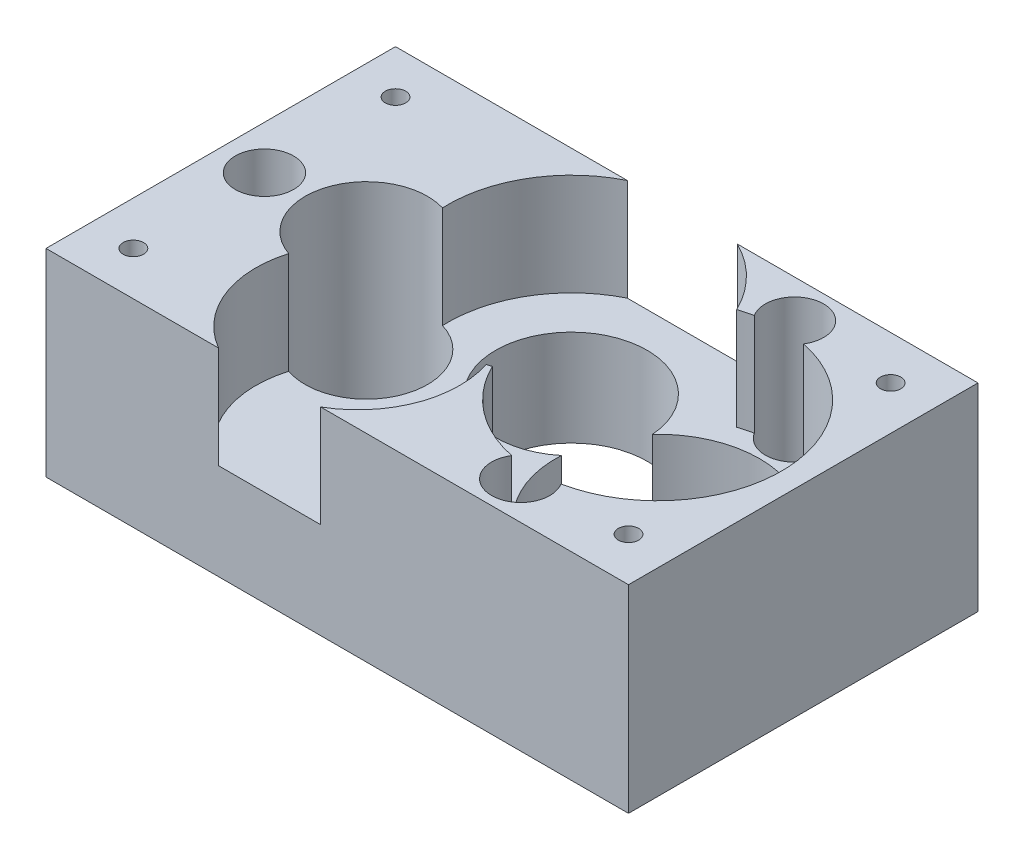
ISO-10303-21;
HEADER;
FILE_DESCRIPTION(('STEP AP214'),'2;1');
FILE_NAME('part.step','',(''),(''),'','','');
FILE_SCHEMA(('AUTOMOTIVE_DESIGN { 1 0 10303 214 1 1 1 1 }'));
ENDSEC;
DATA;
#1=APPLICATION_CONTEXT('core data for automotive mechanical design processes');
#2=APPLICATION_PROTOCOL_DEFINITION('international standard','automotive_design',2000,#1);
#3=PRODUCT_CONTEXT('',#1,'mechanical');
#4=PRODUCT('Part','Part','',(#3));
#5=PRODUCT_RELATED_PRODUCT_CATEGORY('part','',(#4));
#6=PRODUCT_DEFINITION_FORMATION('','',#4);
#7=PRODUCT_DEFINITION_CONTEXT('part definition',#1,'design');
#8=PRODUCT_DEFINITION('design','',#6,#7);
#9=PRODUCT_DEFINITION_SHAPE('','',#8);
#10=(LENGTH_UNIT() NAMED_UNIT(*) SI_UNIT(.MILLI.,.METRE.));
#11=(NAMED_UNIT(*) PLANE_ANGLE_UNIT() SI_UNIT($,.RADIAN.));
#12=(NAMED_UNIT(*) SI_UNIT($,.STERADIAN.) SOLID_ANGLE_UNIT());
#13=UNCERTAINTY_MEASURE_WITH_UNIT(LENGTH_MEASURE(1.E-05),#10,'distance_accuracy_value','');
#14=(GEOMETRIC_REPRESENTATION_CONTEXT(3) GLOBAL_UNCERTAINTY_ASSIGNED_CONTEXT((#13)) GLOBAL_UNIT_ASSIGNED_CONTEXT((#10,
#11,#12)) REPRESENTATION_CONTEXT('',''));
#15=CARTESIAN_POINT('',(0.,0.,0.));
#16=DIRECTION('',(0.,0.,1.));
#17=DIRECTION('',(1.,0.,0.));
#18=AXIS2_PLACEMENT_3D('',#15,#16,#17);
#19=CARTESIAN_POINT('',(15.,6.8,1.3));
#20=DIRECTION('',(0.,-1.,0.));
#21=DIRECTION('',(0.,0.,-1.));
#22=AXIS2_PLACEMENT_3D('',#19,#20,#21);
#23=CYLINDRICAL_SURFACE('',#22,0.75);
#24=CARTESIAN_POINT('',(15.,0.,1.3));
#25=DIRECTION('',(0.,1.,0.));
#26=DIRECTION('',(0.,0.,1.));
#27=AXIS2_PLACEMENT_3D('',#24,#25,#26);
#28=CIRCLE('',#27,0.75);
#29=CARTESIAN_POINT('',(15.,0.,2.05));
#30=VERTEX_POINT('',#29);
#31=EDGE_CURVE('E410',#30,#30,#28,.F.);
#32=ORIENTED_EDGE('',*,*,#31,.T.);
#33=EDGE_LOOP('',(#32));
#34=FACE_BOUND('',#33,.T.);
#35=CARTESIAN_POINT('',(15.,1.,1.3));
#36=DIRECTION('',(0.,1.,0.));
#37=DIRECTION('',(0.,0.,1.));
#38=AXIS2_PLACEMENT_3D('',#35,#36,#37);
#39=CIRCLE('',#38,0.75);
#40=CARTESIAN_POINT('',(15.,1.,2.05));
#41=VERTEX_POINT('',#40);
#42=EDGE_CURVE('E107',#41,#41,#39,.T.);
#43=ORIENTED_EDGE('',*,*,#42,.T.);
#44=EDGE_LOOP('',(#43));
#45=FACE_BOUND('',#44,.T.);
#46=ADVANCED_FACE('F103',(#34,#45),#23,.F.);
#47=CARTESIAN_POINT('',(15.,6.8,10.7));
#48=DIRECTION('',(0.,-1.,0.));
#49=DIRECTION('',(0.,0.,-1.));
#50=AXIS2_PLACEMENT_3D('',#47,#48,#49);
#51=CYLINDRICAL_SURFACE('',#50,0.750000000000002);
#52=CARTESIAN_POINT('',(15.,0.,10.7));
#53=DIRECTION('',(0.,1.,0.));
#54=DIRECTION('',(0.,0.,1.));
#55=AXIS2_PLACEMENT_3D('',#52,#53,#54);
#56=CIRCLE('',#55,0.750000000000002);
#57=CARTESIAN_POINT('',(15.,0.,11.45));
#58=VERTEX_POINT('',#57);
#59=EDGE_CURVE('E412',#58,#58,#56,.F.);
#60=ORIENTED_EDGE('',*,*,#59,.T.);
#61=EDGE_LOOP('',(#60));
#62=FACE_BOUND('',#61,.T.);
#63=CARTESIAN_POINT('',(15.,1.,10.7));
#64=DIRECTION('',(0.,1.,0.));
#65=DIRECTION('',(0.,0.,1.));
#66=AXIS2_PLACEMENT_3D('',#63,#64,#65);
#67=CIRCLE('',#66,0.750000000000002);
#68=CARTESIAN_POINT('',(15.,1.,11.45));
#69=VERTEX_POINT('',#68);
#70=EDGE_CURVE('E391',#69,#69,#67,.T.);
#71=ORIENTED_EDGE('',*,*,#70,.T.);
#72=EDGE_LOOP('',(#71));
#73=FACE_BOUND('',#72,.T.);
#74=ADVANCED_FACE('F497',(#62,#73),#51,.F.);
#75=CARTESIAN_POINT('',(1.49999999999999,6.8,6.));
#76=DIRECTION('',(0.,-1.,0.));
#77=DIRECTION('',(0.,0.,-1.));
#78=AXIS2_PLACEMENT_3D('',#75,#76,#77);
#79=CYLINDRICAL_SURFACE('',#78,0.75);
#80=CARTESIAN_POINT('',(1.49999999999999,0.,6.));
#81=DIRECTION('',(0.,1.,0.));
#82=DIRECTION('',(0.,0.,1.));
#83=AXIS2_PLACEMENT_3D('',#80,#81,#82);
#84=CIRCLE('',#83,0.75);
#85=CARTESIAN_POINT('',(1.49999999999999,0.,6.75));
#86=VERTEX_POINT('',#85);
#87=EDGE_CURVE('E264',#86,#86,#84,.F.);
#88=ORIENTED_EDGE('',*,*,#87,.T.);
#89=EDGE_LOOP('',(#88));
#90=FACE_BOUND('',#89,.T.);
#91=CARTESIAN_POINT('',(1.49999999999999,1.,6.));
#92=DIRECTION('',(0.,1.,0.));
#93=DIRECTION('',(0.,0.,1.));
#94=AXIS2_PLACEMENT_3D('',#91,#92,#93);
#95=CIRCLE('',#94,0.75);
#96=CARTESIAN_POINT('',(1.49999999999999,1.,6.75));
#97=VERTEX_POINT('',#96);
#98=EDGE_CURVE('E389',#97,#97,#95,.T.);
#99=ORIENTED_EDGE('',*,*,#98,.T.);
#100=EDGE_LOOP('',(#99));
#101=FACE_BOUND('',#100,.T.);
#102=ADVANCED_FACE('F503',(#90,#101),#79,.F.);
#103=CARTESIAN_POINT('',(15.,6.8,6.));
#104=DIRECTION('',(0.,-1.,0.));
#105=DIRECTION('',(0.,0.,-1.));
#106=AXIS2_PLACEMENT_3D('',#103,#104,#105);
#107=CYLINDRICAL_SURFACE('',#106,4.25);
#108=DIRECTION('',(0.,1.,0.));
#109=VECTOR('',#108,1.);
#110=CARTESIAN_POINT('',(14.1550469130083,3.9,10.1651595744681));
#111=LINE('',#110,#109);
#112=CARTESIAN_POINT('',(14.1550469130083,3.3,10.1651595744681));
#113=VERTEX_POINT('',#112);
#114=CARTESIAN_POINT('',(14.1550469130083,6.8,10.1651595744681));
#115=VERTEX_POINT('',#114);
#116=EDGE_CURVE('E120',#113,#115,#111,.T.);
#117=ORIENTED_EDGE('',*,*,#116,.F.);
#118=CARTESIAN_POINT('',(15.,3.3,6.));
#119=DIRECTION('',(0.,1.,0.));
#120=DIRECTION('',(0.,0.,1.));
#121=AXIS2_PLACEMENT_3D('',#118,#119,#120);
#122=CIRCLE('',#121,4.25);
#123=CARTESIAN_POINT('',(11.1717072162558,3.3,7.84571784461547));
#124=VERTEX_POINT('',#123);
#125=EDGE_CURVE('E283',#124,#113,#122,.T.);
#126=ORIENTED_EDGE('',*,*,#125,.F.);
#127=DIRECTION('',(0.,-1.,0.));
#128=VECTOR('',#127,1.);
#129=CARTESIAN_POINT('',(11.1717072162558,6.8,7.84571784461547));
#130=LINE('',#129,#128);
#131=CARTESIAN_POINT('',(11.1717072162558,6.8,7.84571784461547));
#132=VERTEX_POINT('',#131);
#133=EDGE_CURVE('E295',#132,#124,#130,.T.);
#134=ORIENTED_EDGE('',*,*,#133,.F.);
#135=CARTESIAN_POINT('',(15.,6.8,6.));
#136=DIRECTION('',(0.,1.,0.));
#137=DIRECTION('',(0.,0.,1.));
#138=AXIS2_PLACEMENT_3D('',#135,#136,#137);
#139=CIRCLE('',#138,4.25);
#140=EDGE_CURVE('E257',#132,#115,#139,.T.);
#141=ORIENTED_EDGE('',*,*,#140,.T.);
#142=EDGE_LOOP('',(#117,#126,#134,#141));
#143=FACE_BOUND('',#142,.T.);
#144=ADVANCED_FACE('F425',(#143),#107,.F.);
#145=DIRECTION('',(0.,1.,0.));
#146=VECTOR('',#145,1.);
#147=CARTESIAN_POINT('',(15.8449530869917,3.9,10.1651595744681));
#148=LINE('',#147,#146);
#149=CARTESIAN_POINT('',(15.8449530869917,6.8,10.1651595744681));
#150=VERTEX_POINT('',#149);
#151=CARTESIAN_POINT('',(15.8449530869917,3.3,10.1651595744681));
#152=VERTEX_POINT('',#151);
#153=EDGE_CURVE('E237',#150,#152,#148,.F.);
#154=ORIENTED_EDGE('',*,*,#153,.F.);
#155=CARTESIAN_POINT('',(15.8449530869917,6.8,1.83484042553191));
#156=VERTEX_POINT('',#155);
#157=EDGE_CURVE('E250',#150,#156,#139,.T.);
#158=ORIENTED_EDGE('',*,*,#157,.T.);
#159=DIRECTION('',(0.,1.,0.));
#160=VECTOR('',#159,1.);
#161=CARTESIAN_POINT('',(15.8449530869917,3.9,1.83484042553191));
#162=LINE('',#161,#160);
#163=CARTESIAN_POINT('',(15.8449530869917,3.3,1.83484042553191));
#164=VERTEX_POINT('',#163);
#165=EDGE_CURVE('E128',#164,#156,#162,.T.);
#166=ORIENTED_EDGE('',*,*,#165,.F.);
#167=EDGE_CURVE('E252',#152,#164,#122,.T.);
#168=ORIENTED_EDGE('',*,*,#167,.F.);
#169=EDGE_LOOP('',(#154,#158,#166,#168));
#170=FACE_BOUND('',#169,.T.);
#171=ADVANCED_FACE('F249',(#170),#107,.F.);
#172=DIRECTION('',(0.,1.,0.));
#173=VECTOR('',#172,1.);
#174=CARTESIAN_POINT('',(14.1550469130083,3.9,1.83484042553191));
#175=LINE('',#174,#173);
#176=CARTESIAN_POINT('',(14.1550469130083,6.8,1.83484042553191));
#177=VERTEX_POINT('',#176);
#178=CARTESIAN_POINT('',(14.1550469130083,3.3,1.83484042553191));
#179=VERTEX_POINT('',#178);
#180=EDGE_CURVE('E399',#177,#179,#175,.F.);
#181=ORIENTED_EDGE('',*,*,#180,.F.);
#182=CARTESIAN_POINT('',(13.6753726461814,6.8,1.96170055920618));
#183=VERTEX_POINT('',#182);
#184=EDGE_CURVE('E258',#177,#183,#139,.T.);
#185=ORIENTED_EDGE('',*,*,#184,.T.);
#186=DIRECTION('',(0.,-1.,0.));
#187=VECTOR('',#186,1.);
#188=CARTESIAN_POINT('',(13.6753726461814,6.8,1.96170055920618));
#189=LINE('',#188,#187);
#190=CARTESIAN_POINT('',(13.6753726461814,3.3,1.96170055920618));
#191=VERTEX_POINT('',#190);
#192=EDGE_CURVE('E282',#183,#191,#189,.T.);
#193=ORIENTED_EDGE('',*,*,#192,.T.);
#194=EDGE_CURVE('E287',#179,#191,#122,.T.);
#195=ORIENTED_EDGE('',*,*,#194,.F.);
#196=EDGE_LOOP('',(#181,#185,#193,#195));
#197=FACE_BOUND('',#196,.T.);
#198=ADVANCED_FACE('F455',(#197),#107,.F.);
#199=CARTESIAN_POINT('',(0.,3.3,0.));
#200=DIRECTION('',(0.,1.,0.));
#201=DIRECTION('',(0.,0.,1.));
#202=AXIS2_PLACEMENT_3D('',#199,#200,#201);
#203=PLANE('',#202);
#204=CARTESIAN_POINT('',(15.,3.3,10.7));
#205=DIRECTION('',(0.,1.,0.));
#206=DIRECTION('',(0.,0.,1.));
#207=AXIS2_PLACEMENT_3D('',#204,#205,#206);
#208=CIRCLE('',#207,1.);
#209=EDGE_CURVE('E253',#152,#113,#208,.T.);
#210=ORIENTED_EDGE('',*,*,#209,.F.);
#211=ORIENTED_EDGE('',*,*,#167,.T.);
#212=CARTESIAN_POINT('',(15.,3.3,1.3));
#213=DIRECTION('',(0.,1.,0.));
#214=DIRECTION('',(0.,0.,1.));
#215=AXIS2_PLACEMENT_3D('',#212,#213,#214);
#216=CIRCLE('',#215,1.);
#217=EDGE_CURVE('E396',#179,#164,#216,.T.);
#218=ORIENTED_EDGE('',*,*,#217,.F.);
#219=ORIENTED_EDGE('',*,*,#194,.T.);
#220=CARTESIAN_POINT('',(9.84707986243722,3.3,3.80741840382166));
#221=DIRECTION('',(0.,1.,0.));
#222=DIRECTION('',(0.,0.,1.));
#223=AXIS2_PLACEMENT_3D('',#220,#221,#222);
#224=CIRCLE('',#223,4.25);
#225=CARTESIAN_POINT('',(11.7354826526915,3.3,0.));
#226=VERTEX_POINT('',#225);
#227=EDGE_CURVE('E286',#191,#226,#224,.T.);
#228=ORIENTED_EDGE('',*,*,#227,.T.);
#229=DIRECTION('',(1.,0.,0.));
#230=VECTOR('',#229,1.);
#231=CARTESIAN_POINT('',(0.,3.3,0.));
#232=LINE('',#231,#230);
#233=CARTESIAN_POINT('',(7.95867707218294,3.3,0.));
#234=VERTEX_POINT('',#233);
#235=EDGE_CURVE('E364',#234,#226,#232,.T.);
#236=ORIENTED_EDGE('',*,*,#235,.F.);
#237=CARTESIAN_POINT('',(9.84707986243722,3.3,3.80741840382166));
#238=DIRECTION('',(0.,1.,0.));
#239=DIRECTION('',(0.,0.,1.));
#240=AXIS2_PLACEMENT_3D('',#237,#238,#239);
#241=CIRCLE('',#240,4.25);
#242=CARTESIAN_POINT('',(5.60090997093726,3.3,3.98781034521391));
#243=VERTEX_POINT('',#242);
#244=EDGE_CURVE('E297',#234,#243,#241,.T.);
#245=ORIENTED_EDGE('',*,*,#244,.T.);
#246=CARTESIAN_POINT('',(5.,3.3,6.));
#247=DIRECTION('',(0.,1.,0.));
#248=DIRECTION('',(0.,0.,1.));
#249=AXIS2_PLACEMENT_3D('',#246,#247,#248);
#250=CIRCLE('',#249,2.1);
#251=CARTESIAN_POINT('',(4.31984150225845,3.3,7.98680256139103));
#252=VERTEX_POINT('',#251);
#253=EDGE_CURVE('E355',#252,#243,#250,.T.);
#254=ORIENTED_EDGE('',*,*,#253,.F.);
#255=CARTESIAN_POINT('',(7.67873609357973,3.3,8.97058461265678));
#256=DIRECTION('',(0.,1.,0.));
#257=DIRECTION('',(0.,0.,1.));
#258=AXIS2_PLACEMENT_3D('',#255,#256,#257);
#259=CIRCLE('',#258,3.5);
#260=CARTESIAN_POINT('',(5.92584065718652,3.3,12.));
#261=VERTEX_POINT('',#260);
#262=EDGE_CURVE('E310',#252,#261,#259,.T.);
#263=ORIENTED_EDGE('',*,*,#262,.T.);
#264=DIRECTION('',(1.,0.,0.));
#265=VECTOR('',#264,1.);
#266=CARTESIAN_POINT('',(0.,3.3,12.));
#267=LINE('',#266,#265);
#268=CARTESIAN_POINT('',(9.43163152997293,3.3,12.));
#269=VERTEX_POINT('',#268);
#270=EDGE_CURVE('E361',#261,#269,#267,.T.);
#271=ORIENTED_EDGE('',*,*,#270,.T.);
#272=CARTESIAN_POINT('',(7.67873609357973,3.3,8.97058461265678));
#273=DIRECTION('',(0.,1.,0.));
#274=DIRECTION('',(0.,0.,1.));
#275=AXIS2_PLACEMENT_3D('',#272,#273,#274);
#276=CIRCLE('',#275,3.5);
#277=CARTESIAN_POINT('',(11.0094872449995,3.3,7.89536520838807));
#278=VERTEX_POINT('',#277);
#279=EDGE_CURVE('E290',#269,#278,#276,.T.);
#280=ORIENTED_EDGE('',*,*,#279,.T.);
#281=CARTESIAN_POINT('',(9.84707986243722,3.3,3.80741840382166));
#282=DIRECTION('',(0.,1.,0.));
#283=DIRECTION('',(0.,0.,1.));
#284=AXIS2_PLACEMENT_3D('',#281,#282,#283);
#285=CIRCLE('',#284,4.25);
#286=EDGE_CURVE('E261',#278,#124,#285,.T.);
#287=ORIENTED_EDGE('',*,*,#286,.T.);
#288=ORIENTED_EDGE('',*,*,#125,.T.);
#289=EDGE_LOOP('',(#210,#211,#218,#219,#228,#236,#245,#254,#263,#271,#280,#287,#288));
#290=FACE_BOUND('',#289,.T.);
#291=CARTESIAN_POINT('',(7.67873609357973,3.3,8.97058461265678));
#292=DIRECTION('',(0.,1.,0.));
#293=DIRECTION('',(0.,0.,1.));
#294=AXIS2_PLACEMENT_3D('',#291,#292,#293);
#295=CIRCLE('',#294,0.6);
#296=CARTESIAN_POINT('',(7.67873609357973,3.3,9.57058461265678));
#297=VERTEX_POINT('',#296);
#298=EDGE_CURVE('E338',#297,#297,#295,.T.);
#299=ORIENTED_EDGE('',*,*,#298,.F.);
#300=EDGE_LOOP('',(#299));
#301=FACE_BOUND('',#300,.T.);
#302=CARTESIAN_POINT('',(15.,3.3,6.));
#303=DIRECTION('',(0.,1.,0.));
#304=DIRECTION('',(0.,0.,1.));
#305=AXIS2_PLACEMENT_3D('',#302,#303,#304);
#306=CIRCLE('',#305,3.5);
#307=CARTESIAN_POINT('',(11.5051547803404,3.3,5.81011347961833));
#308=VERTEX_POINT('',#307);
#309=CARTESIAN_POINT('',(12.4398354279125,3.3,3.61346331186215));
#310=VERTEX_POINT('',#309);
#311=EDGE_CURVE('E349',#308,#310,#306,.T.);
#312=ORIENTED_EDGE('',*,*,#311,.F.);
#313=CARTESIAN_POINT('',(9.84707986243722,3.3,3.80741840382166));
#314=DIRECTION('',(0.,1.,0.));
#315=DIRECTION('',(0.,0.,1.));
#316=AXIS2_PLACEMENT_3D('',#313,#314,#315);
#317=CIRCLE('',#316,2.6);
#318=EDGE_CURVE('E344',#310,#308,#317,.T.);
#319=ORIENTED_EDGE('',*,*,#318,.F.);
#320=EDGE_LOOP('',(#312,#319));
#321=FACE_BOUND('',#320,.T.);
#322=ADVANCED_FACE('F421',(#290,#301,#321),#203,.T.);
#323=CARTESIAN_POINT('',(0.,0.,0.));
#324=DIRECTION('',(0.,1.,0.));
#325=DIRECTION('',(0.,0.,1.));
#326=AXIS2_PLACEMENT_3D('',#323,#324,#325);
#327=PLANE('',#326);
#328=CARTESIAN_POINT('',(18.5,0.,1.5));
#329=DIRECTION('',(0.,1.,0.));
#330=DIRECTION('',(0.,0.,1.));
#331=AXIS2_PLACEMENT_3D('',#328,#329,#330);
#332=CIRCLE('',#331,0.350000000000001);
#333=CARTESIAN_POINT('',(18.5,0.,1.85));
#334=VERTEX_POINT('',#333);
#335=EDGE_CURVE('E478',#334,#334,#332,.T.);
#336=ORIENTED_EDGE('',*,*,#335,.T.);
#337=EDGE_LOOP('',(#336));
#338=FACE_BOUND('',#337,.T.);
#339=CARTESIAN_POINT('',(18.5,0.,10.5));
#340=DIRECTION('',(0.,1.,0.));
#341=DIRECTION('',(0.,0.,1.));
#342=AXIS2_PLACEMENT_3D('',#339,#340,#341);
#343=CIRCLE('',#342,0.350000000000001);
#344=CARTESIAN_POINT('',(18.5,0.,10.85));
#345=VERTEX_POINT('',#344);
#346=EDGE_CURVE('E789',#345,#345,#343,.T.);
#347=ORIENTED_EDGE('',*,*,#346,.T.);
#348=EDGE_LOOP('',(#347));
#349=FACE_BOUND('',#348,.T.);
#350=CARTESIAN_POINT('',(1.5,0.,10.5));
#351=DIRECTION('',(0.,1.,0.));
#352=DIRECTION('',(0.,0.,1.));
#353=AXIS2_PLACEMENT_3D('',#350,#351,#352);
#354=CIRCLE('',#353,0.349999999999999);
#355=CARTESIAN_POINT('',(1.5,0.,10.85));
#356=VERTEX_POINT('',#355);
#357=EDGE_CURVE('E783',#356,#356,#354,.T.);
#358=ORIENTED_EDGE('',*,*,#357,.T.);
#359=EDGE_LOOP('',(#358));
#360=FACE_BOUND('',#359,.T.);
#361=CARTESIAN_POINT('',(1.5,0.,1.5));
#362=DIRECTION('',(0.,1.,0.));
#363=DIRECTION('',(0.,0.,1.));
#364=AXIS2_PLACEMENT_3D('',#361,#362,#363);
#365=CIRCLE('',#364,0.349999999999999);
#366=CARTESIAN_POINT('',(1.5,0.,1.85));
#367=VERTEX_POINT('',#366);
#368=EDGE_CURVE('E470',#367,#367,#365,.T.);
#369=ORIENTED_EDGE('',*,*,#368,.T.);
#370=EDGE_LOOP('',(#369));
#371=FACE_BOUND('',#370,.T.);
#372=ORIENTED_EDGE('',*,*,#87,.F.);
#373=EDGE_LOOP('',(#372));
#374=FACE_BOUND('',#373,.T.);
#375=ORIENTED_EDGE('',*,*,#59,.F.);
#376=EDGE_LOOP('',(#375));
#377=FACE_BOUND('',#376,.T.);
#378=ORIENTED_EDGE('',*,*,#31,.F.);
#379=EDGE_LOOP('',(#378));
#380=FACE_BOUND('',#379,.T.);
#381=CARTESIAN_POINT('',(5.,0.,6.));
#382=DIRECTION('',(0.,1.,0.));
#383=DIRECTION('',(0.,0.,1.));
#384=AXIS2_PLACEMENT_3D('',#381,#382,#383);
#385=CIRCLE('',#384,2.1);
#386=CARTESIAN_POINT('',(5.,0.,8.1));
#387=VERTEX_POINT('',#386);
#388=EDGE_CURVE('E352',#387,#387,#385,.T.);
#389=ORIENTED_EDGE('',*,*,#388,.T.);
#390=EDGE_LOOP('',(#389));
#391=FACE_BOUND('',#390,.T.);
#392=DIRECTION('',(0.,0.,1.));
#393=VECTOR('',#392,1.);
#394=CARTESIAN_POINT('',(0.,0.,0.));
#395=LINE('',#394,#393);
#396=CARTESIAN_POINT('',(0.,0.,0.));
#397=VERTEX_POINT('',#396);
#398=CARTESIAN_POINT('',(0.,0.,12.));
#399=VERTEX_POINT('',#398);
#400=EDGE_CURVE('E358',#397,#399,#395,.T.);
#401=ORIENTED_EDGE('',*,*,#400,.F.);
#402=DIRECTION('',(1.,0.,0.));
#403=VECTOR('',#402,1.);
#404=CARTESIAN_POINT('',(0.,0.,0.));
#405=LINE('',#404,#403);
#406=CARTESIAN_POINT('',(20.,0.,0.));
#407=VERTEX_POINT('',#406);
#408=EDGE_CURVE('E365',#397,#407,#405,.T.);
#409=ORIENTED_EDGE('',*,*,#408,.T.);
#410=DIRECTION('',(0.,0.,1.));
#411=VECTOR('',#410,1.);
#412=CARTESIAN_POINT('',(20.,0.,0.));
#413=LINE('',#412,#411);
#414=CARTESIAN_POINT('',(20.,0.,12.));
#415=VERTEX_POINT('',#414);
#416=EDGE_CURVE('E374',#407,#415,#413,.T.);
#417=ORIENTED_EDGE('',*,*,#416,.T.);
#418=DIRECTION('',(1.,0.,0.));
#419=VECTOR('',#418,1.);
#420=CARTESIAN_POINT('',(0.,0.,12.));
#421=LINE('',#420,#419);
#422=EDGE_CURVE('E371',#399,#415,#421,.T.);
#423=ORIENTED_EDGE('',*,*,#422,.F.);
#424=EDGE_LOOP('',(#401,#409,#417,#423));
#425=FACE_BOUND('',#424,.T.);
#426=CARTESIAN_POINT('',(9.84707986243722,0.,3.80741840382166));
#427=DIRECTION('',(0.,1.,0.));
#428=DIRECTION('',(0.,0.,1.));
#429=AXIS2_PLACEMENT_3D('',#426,#427,#428);
#430=CIRCLE('',#429,2.6);
#431=CARTESIAN_POINT('',(12.4398354279125,0.,3.61346331186215));
#432=VERTEX_POINT('',#431);
#433=CARTESIAN_POINT('',(11.5051547803404,0.,5.81011347961833));
#434=VERTEX_POINT('',#433);
#435=EDGE_CURVE('E341',#432,#434,#430,.T.);
#436=ORIENTED_EDGE('',*,*,#435,.T.);
#437=CARTESIAN_POINT('',(15.,0.,6.));
#438=DIRECTION('',(0.,1.,0.));
#439=DIRECTION('',(0.,0.,1.));
#440=AXIS2_PLACEMENT_3D('',#437,#438,#439);
#441=CIRCLE('',#440,3.5);
#442=EDGE_CURVE('E346',#434,#432,#441,.T.);
#443=ORIENTED_EDGE('',*,*,#442,.T.);
#444=EDGE_LOOP('',(#436,#443));
#445=FACE_BOUND('',#444,.T.);
#446=CARTESIAN_POINT('',(7.67873609357973,0.,8.97058461265678));
#447=DIRECTION('',(0.,1.,0.));
#448=DIRECTION('',(0.,0.,1.));
#449=AXIS2_PLACEMENT_3D('',#446,#447,#448);
#450=CIRCLE('',#449,0.6);
#451=CARTESIAN_POINT('',(7.67873609357973,0.,9.57058461265678));
#452=VERTEX_POINT('',#451);
#453=EDGE_CURVE('E332',#452,#452,#450,.T.);
#454=ORIENTED_EDGE('',*,*,#453,.T.);
#455=EDGE_LOOP('',(#454));
#456=FACE_BOUND('',#455,.T.);
#457=ADVANCED_FACE('F543',(#338,#349,#360,#371,#374,#377,#380,#391,#425,#445,#456),#327,.F.);
#458=CARTESIAN_POINT('',(15.,3.3,6.));
#459=DIRECTION('',(0.,-1.,0.));
#460=DIRECTION('',(0.,0.,-1.));
#461=AXIS2_PLACEMENT_3D('',#458,#459,#460);
#462=CYLINDRICAL_SURFACE('',#461,3.5);
#463=ORIENTED_EDGE('',*,*,#311,.T.);
#464=DIRECTION('',(0.,-1.,0.));
#465=VECTOR('',#464,1.);
#466=CARTESIAN_POINT('',(12.4398354279125,1.65,3.61346331186215));
#467=LINE('',#466,#465);
#468=EDGE_CURVE('E13',#310,#432,#467,.T.);
#469=ORIENTED_EDGE('',*,*,#468,.T.);
#470=ORIENTED_EDGE('',*,*,#442,.F.);
#471=DIRECTION('',(0.,-1.,0.));
#472=VECTOR('',#471,1.);
#473=CARTESIAN_POINT('',(11.5051547803404,1.65,5.81011347961833));
#474=LINE('',#473,#472);
#475=EDGE_CURVE('E112',#434,#308,#474,.F.);
#476=ORIENTED_EDGE('',*,*,#475,.T.);
#477=EDGE_LOOP('',(#463,#469,#470,#476));
#478=FACE_BOUND('',#477,.T.);
#479=ADVANCED_FACE('F540',(#478),#462,.F.);
#480=CARTESIAN_POINT('',(0.,3.3,0.));
#481=DIRECTION('',(1.,0.,0.));
#482=DIRECTION('',(0.,0.,-1.));
#483=AXIS2_PLACEMENT_3D('',#480,#481,#482);
#484=PLANE('',#483);
#485=ORIENTED_EDGE('',*,*,#400,.T.);
#486=DIRECTION('',(0.,-1.,0.));
#487=VECTOR('',#486,1.);
#488=CARTESIAN_POINT('',(0.,3.3,12.));
#489=LINE('',#488,#487);
#490=CARTESIAN_POINT('',(0.,6.8,12.));
#491=VERTEX_POINT('',#490);
#492=EDGE_CURVE('E384',#491,#399,#489,.T.);
#493=ORIENTED_EDGE('',*,*,#492,.F.);
#494=DIRECTION('',(0.,0.,-1.));
#495=VECTOR('',#494,1.);
#496=CARTESIAN_POINT('',(0.,6.8,0.));
#497=LINE('',#496,#495);
#498=CARTESIAN_POINT('',(0.,6.8,0.));
#499=VERTEX_POINT('',#498);
#500=EDGE_CURVE('E309',#491,#499,#497,.T.);
#501=ORIENTED_EDGE('',*,*,#500,.T.);
#502=DIRECTION('',(0.,-1.,0.));
#503=VECTOR('',#502,1.);
#504=CARTESIAN_POINT('',(0.,3.3,0.));
#505=LINE('',#504,#503);
#506=EDGE_CURVE('E368',#499,#397,#505,.T.);
#507=ORIENTED_EDGE('',*,*,#506,.T.);
#508=EDGE_LOOP('',(#485,#493,#501,#507));
#509=FACE_BOUND('',#508,.T.);
#510=ADVANCED_FACE('F105',(#509),#484,.F.);
#511=CARTESIAN_POINT('',(0.,3.3,12.));
#512=DIRECTION('',(0.,0.,-1.));
#513=DIRECTION('',(-1.,0.,0.));
#514=AXIS2_PLACEMENT_3D('',#511,#512,#513);
#515=PLANE('',#514);
#516=ORIENTED_EDGE('',*,*,#422,.T.);
#517=DIRECTION('',(0.,-1.,0.));
#518=VECTOR('',#517,1.);
#519=CARTESIAN_POINT('',(20.,3.3,12.));
#520=LINE('',#519,#518);
#521=CARTESIAN_POINT('',(20.,6.8,12.));
#522=VERTEX_POINT('',#521);
#523=EDGE_CURVE('E382',#522,#415,#520,.T.);
#524=ORIENTED_EDGE('',*,*,#523,.F.);
#525=DIRECTION('',(-1.,0.,0.));
#526=VECTOR('',#525,1.);
#527=CARTESIAN_POINT('',(0.,6.8,12.));
#528=LINE('',#527,#526);
#529=CARTESIAN_POINT('',(9.43163152997293,6.8,12.));
#530=VERTEX_POINT('',#529);
#531=EDGE_CURVE('E273',#522,#530,#528,.T.);
#532=ORIENTED_EDGE('',*,*,#531,.T.);
#533=DIRECTION('',(0.,-1.,0.));
#534=VECTOR('',#533,1.);
#535=CARTESIAN_POINT('',(9.43163152997293,6.8,12.));
#536=LINE('',#535,#534);
#537=EDGE_CURVE('E300',#530,#269,#536,.T.);
#538=ORIENTED_EDGE('',*,*,#537,.T.);
#539=ORIENTED_EDGE('',*,*,#270,.F.);
#540=DIRECTION('',(0.,-1.,0.));
#541=VECTOR('',#540,1.);
#542=CARTESIAN_POINT('',(5.92584065718652,6.8,12.));
#543=LINE('',#542,#541);
#544=CARTESIAN_POINT('',(5.92584065718652,6.8,12.));
#545=VERTEX_POINT('',#544);
#546=EDGE_CURVE('E330',#545,#261,#543,.T.);
#547=ORIENTED_EDGE('',*,*,#546,.F.);
#548=DIRECTION('',(-1.,0.,0.));
#549=VECTOR('',#548,1.);
#550=CARTESIAN_POINT('',(0.,6.8,12.));
#551=LINE('',#550,#549);
#552=EDGE_CURVE('E306',#545,#491,#551,.T.);
#553=ORIENTED_EDGE('',*,*,#552,.T.);
#554=ORIENTED_EDGE('',*,*,#492,.T.);
#555=EDGE_LOOP('',(#516,#524,#532,#538,#539,#547,#553,#554));
#556=FACE_BOUND('',#555,.T.);
#557=ADVANCED_FACE('F436',(#556),#515,.F.);
#558=CARTESIAN_POINT('',(20.,3.3,0.));
#559=DIRECTION('',(1.,0.,0.));
#560=DIRECTION('',(0.,0.,-1.));
#561=AXIS2_PLACEMENT_3D('',#558,#559,#560);
#562=PLANE('',#561);
#563=ORIENTED_EDGE('',*,*,#416,.F.);
#564=DIRECTION('',(0.,-1.,0.));
#565=VECTOR('',#564,1.);
#566=CARTESIAN_POINT('',(20.,3.3,0.));
#567=LINE('',#566,#565);
#568=CARTESIAN_POINT('',(20.,6.8,0.));
#569=VERTEX_POINT('',#568);
#570=EDGE_CURVE('E380',#569,#407,#567,.T.);
#571=ORIENTED_EDGE('',*,*,#570,.F.);
#572=DIRECTION('',(0.,0.,-1.));
#573=VECTOR('',#572,1.);
#574=CARTESIAN_POINT('',(20.,6.8,0.));
#575=LINE('',#574,#573);
#576=EDGE_CURVE('E270',#522,#569,#575,.T.);
#577=ORIENTED_EDGE('',*,*,#576,.F.);
#578=ORIENTED_EDGE('',*,*,#523,.T.);
#579=EDGE_LOOP('',(#563,#571,#577,#578));
#580=FACE_BOUND('',#579,.T.);
#581=ADVANCED_FACE('F441',(#580),#562,.T.);
#582=CARTESIAN_POINT('',(0.,3.3,0.));
#583=DIRECTION('',(0.,0.,-1.));
#584=DIRECTION('',(-1.,0.,0.));
#585=AXIS2_PLACEMENT_3D('',#582,#583,#584);
#586=PLANE('',#585);
#587=ORIENTED_EDGE('',*,*,#408,.F.);
#588=ORIENTED_EDGE('',*,*,#506,.F.);
#589=DIRECTION('',(-1.,0.,0.));
#590=VECTOR('',#589,1.);
#591=CARTESIAN_POINT('',(0.,6.8,0.));
#592=LINE('',#591,#590);
#593=CARTESIAN_POINT('',(7.95867707218294,6.8,0.));
#594=VERTEX_POINT('',#593);
#595=EDGE_CURVE('E313',#594,#499,#592,.T.);
#596=ORIENTED_EDGE('',*,*,#595,.F.);
#597=DIRECTION('',(0.,-1.,0.));
#598=VECTOR('',#597,1.);
#599=CARTESIAN_POINT('',(7.95867707218294,6.8,0.));
#600=LINE('',#599,#598);
#601=EDGE_CURVE('E325',#594,#234,#600,.T.);
#602=ORIENTED_EDGE('',*,*,#601,.T.);
#603=ORIENTED_EDGE('',*,*,#235,.T.);
#604=DIRECTION('',(0.,-1.,0.));
#605=VECTOR('',#604,1.);
#606=CARTESIAN_POINT('',(11.7354826526915,6.8,0.));
#607=LINE('',#606,#605);
#608=CARTESIAN_POINT('',(11.7354826526915,6.8,0.));
#609=VERTEX_POINT('',#608);
#610=EDGE_CURVE('E302',#609,#226,#607,.T.);
#611=ORIENTED_EDGE('',*,*,#610,.F.);
#612=DIRECTION('',(-1.,0.,0.));
#613=VECTOR('',#612,1.);
#614=CARTESIAN_POINT('',(0.,6.8,0.));
#615=LINE('',#614,#613);
#616=EDGE_CURVE('E268',#569,#609,#615,.T.);
#617=ORIENTED_EDGE('',*,*,#616,.F.);
#618=ORIENTED_EDGE('',*,*,#570,.T.);
#619=EDGE_LOOP('',(#587,#588,#596,#602,#603,#611,#617,#618));
#620=FACE_BOUND('',#619,.T.);
#621=ADVANCED_FACE('F447',(#620),#586,.T.);
#622=CARTESIAN_POINT('',(5.,3.3,6.));
#623=DIRECTION('',(0.,-1.,0.));
#624=DIRECTION('',(0.,0.,-1.));
#625=AXIS2_PLACEMENT_3D('',#622,#623,#624);
#626=CYLINDRICAL_SURFACE('',#625,2.1);
#627=ORIENTED_EDGE('',*,*,#253,.T.);
#628=DIRECTION('',(0.,-1.,0.));
#629=VECTOR('',#628,1.);
#630=CARTESIAN_POINT('',(5.60090997093726,6.8,3.98781034521391));
#631=LINE('',#630,#629);
#632=CARTESIAN_POINT('',(5.60090997093726,6.8,3.98781034521391));
#633=VERTEX_POINT('',#632);
#634=EDGE_CURVE('E335',#633,#243,#631,.T.);
#635=ORIENTED_EDGE('',*,*,#634,.F.);
#636=CARTESIAN_POINT('',(5.,6.8,6.));
#637=DIRECTION('',(0.,1.,0.));
#638=DIRECTION('',(0.,0.,1.));
#639=AXIS2_PLACEMENT_3D('',#636,#637,#638);
#640=CIRCLE('',#639,2.1);
#641=CARTESIAN_POINT('',(4.31984150225845,6.8,7.98680256139103));
#642=VERTEX_POINT('',#641);
#643=EDGE_CURVE('E319',#633,#642,#640,.T.);
#644=ORIENTED_EDGE('',*,*,#643,.T.);
#645=DIRECTION('',(0.,-1.,0.));
#646=VECTOR('',#645,1.);
#647=CARTESIAN_POINT('',(4.31984150225845,6.8,7.98680256139103));
#648=LINE('',#647,#646);
#649=EDGE_CURVE('E333',#642,#252,#648,.T.);
#650=ORIENTED_EDGE('',*,*,#649,.T.);
#651=EDGE_LOOP('',(#627,#635,#644,#650));
#652=FACE_BOUND('',#651,.T.);
#653=ORIENTED_EDGE('',*,*,#388,.F.);
#654=EDGE_LOOP('',(#653));
#655=FACE_BOUND('',#654,.T.);
#656=ADVANCED_FACE('F538',(#652,#655),#626,.F.);
#657=CARTESIAN_POINT('',(9.84707986243722,3.3,3.80741840382166));
#658=DIRECTION('',(0.,-1.,0.));
#659=DIRECTION('',(0.,0.,-1.));
#660=AXIS2_PLACEMENT_3D('',#657,#658,#659);
#661=CYLINDRICAL_SURFACE('',#660,2.6);
#662=ORIENTED_EDGE('',*,*,#318,.T.);
#663=ORIENTED_EDGE('',*,*,#475,.F.);
#664=ORIENTED_EDGE('',*,*,#435,.F.);
#665=ORIENTED_EDGE('',*,*,#468,.F.);
#666=EDGE_LOOP('',(#662,#663,#664,#665));
#667=FACE_BOUND('',#666,.T.);
#668=ADVANCED_FACE('F534',(#667),#661,.F.);
#669=CARTESIAN_POINT('',(7.67873609357973,3.3,8.97058461265678));
#670=DIRECTION('',(0.,-1.,0.));
#671=DIRECTION('',(0.,0.,-1.));
#672=AXIS2_PLACEMENT_3D('',#669,#670,#671);
#673=CYLINDRICAL_SURFACE('',#672,0.6);
#674=ORIENTED_EDGE('',*,*,#298,.T.);
#675=EDGE_LOOP('',(#674));
#676=FACE_BOUND('',#675,.T.);
#677=ORIENTED_EDGE('',*,*,#453,.F.);
#678=EDGE_LOOP('',(#677));
#679=FACE_BOUND('',#678,.T.);
#680=ADVANCED_FACE('F527',(#676,#679),#673,.F.);
#681=CARTESIAN_POINT('',(7.67873609357973,6.8,8.97058461265678));
#682=DIRECTION('',(0.,-1.,0.));
#683=DIRECTION('',(0.,0.,-1.));
#684=AXIS2_PLACEMENT_3D('',#681,#682,#683);
#685=CYLINDRICAL_SURFACE('',#684,3.5);
#686=ORIENTED_EDGE('',*,*,#262,.F.);
#687=ORIENTED_EDGE('',*,*,#649,.F.);
#688=CARTESIAN_POINT('',(7.67873609357973,6.8,8.97058461265678));
#689=DIRECTION('',(0.,1.,0.));
#690=DIRECTION('',(0.,0.,1.));
#691=AXIS2_PLACEMENT_3D('',#688,#689,#690);
#692=CIRCLE('',#691,3.5);
#693=EDGE_CURVE('E322',#642,#545,#692,.T.);
#694=ORIENTED_EDGE('',*,*,#693,.T.);
#695=ORIENTED_EDGE('',*,*,#546,.T.);
#696=EDGE_LOOP('',(#686,#687,#694,#695));
#697=FACE_BOUND('',#696,.T.);
#698=ADVANCED_FACE('F524',(#697),#685,.F.);
#699=CARTESIAN_POINT('',(9.84707986243722,6.8,3.80741840382166));
#700=DIRECTION('',(0.,-1.,0.));
#701=DIRECTION('',(0.,0.,-1.));
#702=AXIS2_PLACEMENT_3D('',#699,#700,#701);
#703=CYLINDRICAL_SURFACE('',#702,4.25);
#704=ORIENTED_EDGE('',*,*,#244,.F.);
#705=ORIENTED_EDGE('',*,*,#601,.F.);
#706=CARTESIAN_POINT('',(9.84707986243722,6.8,3.80741840382166));
#707=DIRECTION('',(0.,1.,0.));
#708=DIRECTION('',(0.,0.,1.));
#709=AXIS2_PLACEMENT_3D('',#706,#707,#708);
#710=CIRCLE('',#709,4.25);
#711=EDGE_CURVE('E316',#594,#633,#710,.T.);
#712=ORIENTED_EDGE('',*,*,#711,.T.);
#713=ORIENTED_EDGE('',*,*,#634,.T.);
#714=EDGE_LOOP('',(#704,#705,#712,#713));
#715=FACE_BOUND('',#714,.T.);
#716=ADVANCED_FACE('F522',(#715),#703,.F.);
#717=CARTESIAN_POINT('',(9.84707986243722,6.8,3.80741840382166));
#718=DIRECTION('',(0.,1.,0.));
#719=DIRECTION('',(0.,0.,1.));
#720=AXIS2_PLACEMENT_3D('',#717,#718,#719);
#721=PLANE('',#720);
#722=CARTESIAN_POINT('',(1.5,6.8,10.5));
#723=DIRECTION('',(0.,1.,0.));
#724=DIRECTION('',(0.,0.,1.));
#725=AXIS2_PLACEMENT_3D('',#722,#723,#724);
#726=CIRCLE('',#725,0.349999999999999);
#727=CARTESIAN_POINT('',(1.5,6.8,10.85));
#728=VERTEX_POINT('',#727);
#729=EDGE_CURVE('E475',#728,#728,#726,.T.);
#730=ORIENTED_EDGE('',*,*,#729,.F.);
#731=EDGE_LOOP('',(#730));
#732=FACE_BOUND('',#731,.T.);
#733=CARTESIAN_POINT('',(1.5,6.8,1.5));
#734=DIRECTION('',(0.,1.,0.));
#735=DIRECTION('',(0.,0.,1.));
#736=AXIS2_PLACEMENT_3D('',#733,#734,#735);
#737=CIRCLE('',#736,0.349999999999999);
#738=CARTESIAN_POINT('',(1.5,6.8,1.85));
#739=VERTEX_POINT('',#738);
#740=EDGE_CURVE('E465',#739,#739,#737,.T.);
#741=ORIENTED_EDGE('',*,*,#740,.F.);
#742=EDGE_LOOP('',(#741));
#743=FACE_BOUND('',#742,.T.);
#744=CARTESIAN_POINT('',(1.49999999999999,6.8,6.));
#745=DIRECTION('',(0.,1.,0.));
#746=DIRECTION('',(0.,0.,1.));
#747=AXIS2_PLACEMENT_3D('',#744,#745,#746);
#748=CIRCLE('',#747,1.);
#749=CARTESIAN_POINT('',(1.49999999999999,6.8,7.));
#750=VERTEX_POINT('',#749);
#751=EDGE_CURVE('E404',#750,#750,#748,.T.);
#752=ORIENTED_EDGE('',*,*,#751,.F.);
#753=EDGE_LOOP('',(#752));
#754=FACE_BOUND('',#753,.T.);
#755=ORIENTED_EDGE('',*,*,#552,.F.);
#756=ORIENTED_EDGE('',*,*,#693,.F.);
#757=ORIENTED_EDGE('',*,*,#643,.F.);
#758=ORIENTED_EDGE('',*,*,#711,.F.);
#759=ORIENTED_EDGE('',*,*,#595,.T.);
#760=ORIENTED_EDGE('',*,*,#500,.F.);
#761=EDGE_LOOP('',(#755,#756,#757,#758,#759,#760));
#762=FACE_BOUND('',#761,.T.);
#763=ADVANCED_FACE('F513',(#732,#743,#754,#762),#721,.T.);
#764=CARTESIAN_POINT('',(9.84707986243722,6.8,3.80741840382166));
#765=DIRECTION('',(0.,-1.,0.));
#766=DIRECTION('',(0.,0.,-1.));
#767=AXIS2_PLACEMENT_3D('',#764,#765,#766);
#768=CYLINDRICAL_SURFACE('',#767,4.25);
#769=ORIENTED_EDGE('',*,*,#286,.F.);
#770=DIRECTION('',(0.,-1.,0.));
#771=VECTOR('',#770,1.);
#772=CARTESIAN_POINT('',(11.0094872449995,6.8,7.89536520838807));
#773=LINE('',#772,#771);
#774=CARTESIAN_POINT('',(11.0094872449995,6.8,7.89536520838807));
#775=VERTEX_POINT('',#774);
#776=EDGE_CURVE('E298',#775,#278,#773,.T.);
#777=ORIENTED_EDGE('',*,*,#776,.F.);
#778=CARTESIAN_POINT('',(9.84707986243722,6.8,3.80741840382166));
#779=DIRECTION('',(0.,1.,0.));
#780=DIRECTION('',(0.,0.,1.));
#781=AXIS2_PLACEMENT_3D('',#778,#779,#780);
#782=CIRCLE('',#781,4.25);
#783=EDGE_CURVE('E279',#775,#132,#782,.T.);
#784=ORIENTED_EDGE('',*,*,#783,.T.);
#785=ORIENTED_EDGE('',*,*,#133,.T.);
#786=EDGE_LOOP('',(#769,#777,#784,#785));
#787=FACE_BOUND('',#786,.T.);
#788=ADVANCED_FACE('F430',(#787),#768,.F.);
#789=CARTESIAN_POINT('',(7.67873609357973,6.8,8.97058461265678));
#790=DIRECTION('',(0.,-1.,0.));
#791=DIRECTION('',(0.,0.,-1.));
#792=AXIS2_PLACEMENT_3D('',#789,#790,#791);
#793=CYLINDRICAL_SURFACE('',#792,3.5);
#794=ORIENTED_EDGE('',*,*,#279,.F.);
#795=ORIENTED_EDGE('',*,*,#537,.F.);
#796=CARTESIAN_POINT('',(7.67873609357973,6.8,8.97058461265678));
#797=DIRECTION('',(0.,1.,0.));
#798=DIRECTION('',(0.,0.,1.));
#799=AXIS2_PLACEMENT_3D('',#796,#797,#798);
#800=CIRCLE('',#799,3.5);
#801=EDGE_CURVE('E276',#530,#775,#800,.T.);
#802=ORIENTED_EDGE('',*,*,#801,.T.);
#803=ORIENTED_EDGE('',*,*,#776,.T.);
#804=EDGE_LOOP('',(#794,#795,#802,#803));
#805=FACE_BOUND('',#804,.T.);
#806=ADVANCED_FACE('F433',(#805),#793,.F.);
#807=CARTESIAN_POINT('',(9.84707986243722,6.8,3.80741840382166));
#808=DIRECTION('',(0.,-1.,0.));
#809=DIRECTION('',(0.,0.,-1.));
#810=AXIS2_PLACEMENT_3D('',#807,#808,#809);
#811=CYLINDRICAL_SURFACE('',#810,4.25);
#812=ORIENTED_EDGE('',*,*,#227,.F.);
#813=ORIENTED_EDGE('',*,*,#192,.F.);
#814=CARTESIAN_POINT('',(9.84707986243722,6.8,3.80741840382166));
#815=DIRECTION('',(0.,1.,0.));
#816=DIRECTION('',(0.,0.,1.));
#817=AXIS2_PLACEMENT_3D('',#814,#815,#816);
#818=CIRCLE('',#817,4.25);
#819=EDGE_CURVE('E260',#183,#609,#818,.T.);
#820=ORIENTED_EDGE('',*,*,#819,.T.);
#821=ORIENTED_EDGE('',*,*,#610,.T.);
#822=EDGE_LOOP('',(#812,#813,#820,#821));
#823=FACE_BOUND('',#822,.T.);
#824=ADVANCED_FACE('F452',(#823),#811,.F.);
#825=CARTESIAN_POINT('',(15.,6.8,6.));
#826=DIRECTION('',(0.,1.,0.));
#827=DIRECTION('',(0.,0.,1.));
#828=AXIS2_PLACEMENT_3D('',#825,#826,#827);
#829=PLANE('',#828);
#830=CARTESIAN_POINT('',(18.5,6.8,1.5));
#831=DIRECTION('',(0.,1.,0.));
#832=DIRECTION('',(0.,0.,1.));
#833=AXIS2_PLACEMENT_3D('',#830,#831,#832);
#834=CIRCLE('',#833,0.350000000000001);
#835=CARTESIAN_POINT('',(18.5,6.8,1.85));
#836=VERTEX_POINT('',#835);
#837=EDGE_CURVE('E793',#836,#836,#834,.T.);
#838=ORIENTED_EDGE('',*,*,#837,.F.);
#839=EDGE_LOOP('',(#838));
#840=FACE_BOUND('',#839,.T.);
#841=CARTESIAN_POINT('',(18.5,6.8,10.5));
#842=DIRECTION('',(0.,1.,0.));
#843=DIRECTION('',(0.,0.,1.));
#844=AXIS2_PLACEMENT_3D('',#841,#842,#843);
#845=CIRCLE('',#844,0.350000000000001);
#846=CARTESIAN_POINT('',(18.5,6.8,10.85));
#847=VERTEX_POINT('',#846);
#848=EDGE_CURVE('E785',#847,#847,#845,.T.);
#849=ORIENTED_EDGE('',*,*,#848,.F.);
#850=EDGE_LOOP('',(#849));
#851=FACE_BOUND('',#850,.T.);
#852=CARTESIAN_POINT('',(15.,6.8,10.7));
#853=DIRECTION('',(0.,1.,0.));
#854=DIRECTION('',(0.,0.,1.));
#855=AXIS2_PLACEMENT_3D('',#852,#853,#854);
#856=CIRCLE('',#855,1.);
#857=EDGE_CURVE('E233',#115,#150,#856,.T.);
#858=ORIENTED_EDGE('',*,*,#857,.F.);
#859=ORIENTED_EDGE('',*,*,#140,.F.);
#860=ORIENTED_EDGE('',*,*,#783,.F.);
#861=ORIENTED_EDGE('',*,*,#801,.F.);
#862=ORIENTED_EDGE('',*,*,#531,.F.);
#863=ORIENTED_EDGE('',*,*,#576,.T.);
#864=ORIENTED_EDGE('',*,*,#616,.T.);
#865=ORIENTED_EDGE('',*,*,#819,.F.);
#866=ORIENTED_EDGE('',*,*,#184,.F.);
#867=CARTESIAN_POINT('',(15.,6.8,1.3));
#868=DIRECTION('',(0.,1.,0.));
#869=DIRECTION('',(0.,0.,1.));
#870=AXIS2_PLACEMENT_3D('',#867,#868,#869);
#871=CIRCLE('',#870,1.);
#872=EDGE_CURVE('E244',#156,#177,#871,.T.);
#873=ORIENTED_EDGE('',*,*,#872,.F.);
#874=ORIENTED_EDGE('',*,*,#157,.F.);
#875=EDGE_LOOP('',(#858,#859,#860,#861,#862,#863,#864,#865,#866,#873,#874));
#876=FACE_BOUND('',#875,.T.);
#877=ADVANCED_FACE('F255',(#840,#851,#876),#829,.T.);
#878=CARTESIAN_POINT('',(1.49999999999999,-2.82842712474619,6.));
#879=DIRECTION('',(0.,1.,0.));
#880=DIRECTION('',(0.,0.,1.));
#881=AXIS2_PLACEMENT_3D('',#878,#879,#880);
#882=CYLINDRICAL_SURFACE('',#881,1.);
#883=CARTESIAN_POINT('',(1.49999999999999,1.,6.));
#884=DIRECTION('',(0.,1.,0.));
#885=DIRECTION('',(0.,0.,1.));
#886=AXIS2_PLACEMENT_3D('',#883,#884,#885);
#887=CIRCLE('',#886,1.);
#888=CARTESIAN_POINT('',(1.49999999999999,1.,7.));
#889=VERTEX_POINT('',#888);
#890=EDGE_CURVE('E463',#889,#889,#887,.F.);
#891=ORIENTED_EDGE('',*,*,#890,.T.);
#892=EDGE_LOOP('',(#891));
#893=FACE_BOUND('',#892,.T.);
#894=ORIENTED_EDGE('',*,*,#751,.T.);
#895=EDGE_LOOP('',(#894));
#896=FACE_BOUND('',#895,.T.);
#897=ADVANCED_FACE('F509',(#893,#896),#882,.F.);
#898=CARTESIAN_POINT('',(0.,1.,0.));
#899=DIRECTION('',(0.,1.,0.));
#900=DIRECTION('',(0.,0.,1.));
#901=AXIS2_PLACEMENT_3D('',#898,#899,#900);
#902=PLANE('',#901);
#903=ORIENTED_EDGE('',*,*,#98,.F.);
#904=EDGE_LOOP('',(#903));
#905=FACE_BOUND('',#904,.T.);
#906=ORIENTED_EDGE('',*,*,#890,.F.);
#907=EDGE_LOOP('',(#906));
#908=FACE_BOUND('',#907,.T.);
#909=ADVANCED_FACE('F493',(#905,#908),#902,.T.);
#910=CARTESIAN_POINT('',(15.,-2.82842712474619,10.7));
#911=DIRECTION('',(0.,1.,0.));
#912=DIRECTION('',(0.,0.,1.));
#913=AXIS2_PLACEMENT_3D('',#910,#911,#912);
#914=CYLINDRICAL_SURFACE('',#913,1.);
#915=ORIENTED_EDGE('',*,*,#116,.T.);
#916=ORIENTED_EDGE('',*,*,#857,.T.);
#917=ORIENTED_EDGE('',*,*,#153,.T.);
#918=ORIENTED_EDGE('',*,*,#209,.T.);
#919=EDGE_LOOP('',(#915,#916,#917,#918));
#920=FACE_BOUND('',#919,.T.);
#921=CARTESIAN_POINT('',(15.,1.,10.7));
#922=DIRECTION('',(0.,1.,0.));
#923=DIRECTION('',(0.,0.,1.));
#924=AXIS2_PLACEMENT_3D('',#921,#922,#923);
#925=CIRCLE('',#924,1.);
#926=CARTESIAN_POINT('',(15.,1.,11.7));
#927=VERTEX_POINT('',#926);
#928=EDGE_CURVE('E243',#927,#927,#925,.F.);
#929=ORIENTED_EDGE('',*,*,#928,.T.);
#930=EDGE_LOOP('',(#929));
#931=FACE_BOUND('',#930,.T.);
#932=ADVANCED_FACE('F235',(#920,#931),#914,.F.);
#933=CARTESIAN_POINT('',(0.,1.,0.));
#934=DIRECTION('',(0.,1.,0.));
#935=DIRECTION('',(0.,0.,1.));
#936=AXIS2_PLACEMENT_3D('',#933,#934,#935);
#937=PLANE('',#936);
#938=ORIENTED_EDGE('',*,*,#70,.F.);
#939=EDGE_LOOP('',(#938));
#940=FACE_BOUND('',#939,.T.);
#941=ORIENTED_EDGE('',*,*,#928,.F.);
#942=EDGE_LOOP('',(#941));
#943=FACE_BOUND('',#942,.T.);
#944=ADVANCED_FACE('F483',(#940,#943),#937,.T.);
#945=CARTESIAN_POINT('',(15.,-2.82842712474619,1.3));
#946=DIRECTION('',(0.,1.,0.));
#947=DIRECTION('',(0.,0.,1.));
#948=AXIS2_PLACEMENT_3D('',#945,#946,#947);
#949=CYLINDRICAL_SURFACE('',#948,1.);
#950=ORIENTED_EDGE('',*,*,#165,.T.);
#951=ORIENTED_EDGE('',*,*,#872,.T.);
#952=ORIENTED_EDGE('',*,*,#180,.T.);
#953=ORIENTED_EDGE('',*,*,#217,.T.);
#954=EDGE_LOOP('',(#950,#951,#952,#953));
#955=FACE_BOUND('',#954,.T.);
#956=CARTESIAN_POINT('',(15.,1.,1.3));
#957=DIRECTION('',(0.,1.,0.));
#958=DIRECTION('',(0.,0.,1.));
#959=AXIS2_PLACEMENT_3D('',#956,#957,#958);
#960=CIRCLE('',#959,1.);
#961=CARTESIAN_POINT('',(15.,1.,2.3));
#962=VERTEX_POINT('',#961);
#963=EDGE_CURVE('E458',#962,#962,#960,.F.);
#964=ORIENTED_EDGE('',*,*,#963,.T.);
#965=EDGE_LOOP('',(#964));
#966=FACE_BOUND('',#965,.T.);
#967=ADVANCED_FACE('F456',(#955,#966),#949,.F.);
#968=CARTESIAN_POINT('',(0.,1.,0.));
#969=DIRECTION('',(0.,1.,0.));
#970=DIRECTION('',(0.,0.,1.));
#971=AXIS2_PLACEMENT_3D('',#968,#969,#970);
#972=PLANE('',#971);
#973=ORIENTED_EDGE('',*,*,#42,.F.);
#974=EDGE_LOOP('',(#973));
#975=FACE_BOUND('',#974,.T.);
#976=ORIENTED_EDGE('',*,*,#963,.F.);
#977=EDGE_LOOP('',(#976));
#978=FACE_BOUND('',#977,.T.);
#979=ADVANCED_FACE('F491',(#975,#978),#972,.T.);
#980=CARTESIAN_POINT('',(18.5,6.8,10.5));
#981=DIRECTION('',(0.,-1.,0.));
#982=DIRECTION('',(0.,0.,-1.));
#983=AXIS2_PLACEMENT_3D('',#980,#981,#982);
#984=CYLINDRICAL_SURFACE('',#983,0.350000000000001);
#985=ORIENTED_EDGE('',*,*,#848,.T.);
#986=EDGE_LOOP('',(#985));
#987=FACE_BOUND('',#986,.T.);
#988=ORIENTED_EDGE('',*,*,#346,.F.);
#989=EDGE_LOOP('',(#988));
#990=FACE_BOUND('',#989,.T.);
#991=ADVANCED_FACE('F739',(#987,#990),#984,.F.);
#992=CARTESIAN_POINT('',(18.5,6.8,1.5));
#993=DIRECTION('',(0.,-1.,0.));
#994=DIRECTION('',(0.,0.,-1.));
#995=AXIS2_PLACEMENT_3D('',#992,#993,#994);
#996=CYLINDRICAL_SURFACE('',#995,0.350000000000001);
#997=ORIENTED_EDGE('',*,*,#837,.T.);
#998=EDGE_LOOP('',(#997));
#999=FACE_BOUND('',#998,.T.);
#1000=ORIENTED_EDGE('',*,*,#335,.F.);
#1001=EDGE_LOOP('',(#1000));
#1002=FACE_BOUND('',#1001,.T.);
#1003=ADVANCED_FACE('F744',(#999,#1002),#996,.F.);
#1004=CARTESIAN_POINT('',(1.5,6.8,1.5));
#1005=DIRECTION('',(0.,-1.,0.));
#1006=DIRECTION('',(0.,0.,-1.));
#1007=AXIS2_PLACEMENT_3D('',#1004,#1005,#1006);
#1008=CYLINDRICAL_SURFACE('',#1007,0.349999999999999);
#1009=ORIENTED_EDGE('',*,*,#740,.T.);
#1010=EDGE_LOOP('',(#1009));
#1011=FACE_BOUND('',#1010,.T.);
#1012=ORIENTED_EDGE('',*,*,#368,.F.);
#1013=EDGE_LOOP('',(#1012));
#1014=FACE_BOUND('',#1013,.T.);
#1015=ADVANCED_FACE('F756',(#1011,#1014),#1008,.F.);
#1016=CARTESIAN_POINT('',(1.5,6.8,10.5));
#1017=DIRECTION('',(0.,-1.,0.));
#1018=DIRECTION('',(0.,0.,-1.));
#1019=AXIS2_PLACEMENT_3D('',#1016,#1017,#1018);
#1020=CYLINDRICAL_SURFACE('',#1019,0.349999999999999);
#1021=ORIENTED_EDGE('',*,*,#729,.T.);
#1022=EDGE_LOOP('',(#1021));
#1023=FACE_BOUND('',#1022,.T.);
#1024=ORIENTED_EDGE('',*,*,#357,.F.);
#1025=EDGE_LOOP('',(#1024));
#1026=FACE_BOUND('',#1025,.T.);
#1027=ADVANCED_FACE('F766',(#1023,#1026),#1020,.F.);
#1028=CLOSED_SHELL('',(#46,#74,#102,#144,#171,#198,#322,#457,#479,#510,#557,#581,#621,#656,#668,
#680,#698,#716,#763,#788,#806,#824,#877,#897,#909,#932,#944,#967,#979,#991,#1003,#1015,#1027));
#1029=MANIFOLD_SOLID_BREP('B2',#1028);
#1030=ADVANCED_BREP_SHAPE_REPRESENTATION('',(#18,#1029),#14);
#1031=SHAPE_DEFINITION_REPRESENTATION(#9,#1030);
ENDSEC;
END-ISO-10303-21;
